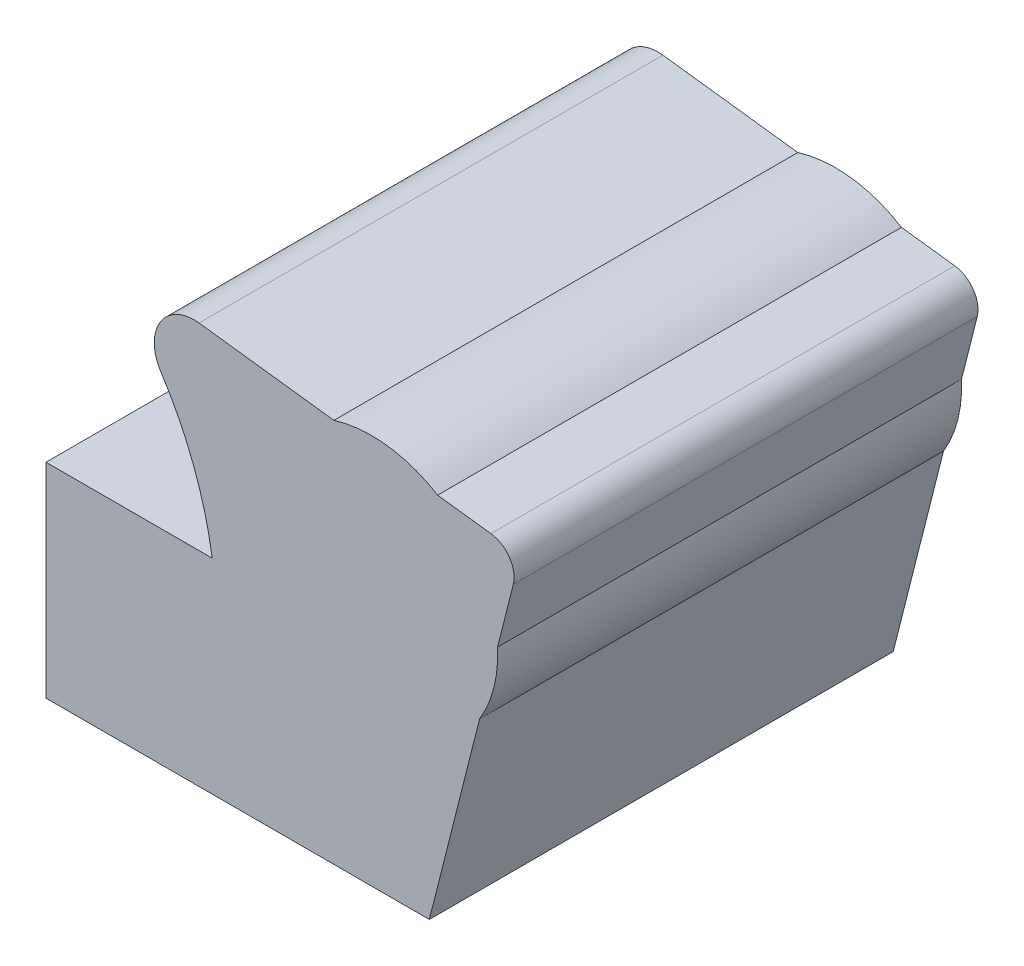
ISO-10303-21;
HEADER;
FILE_DESCRIPTION(('STEP AP214'),'2;1');
FILE_NAME('part.step','',(''),(''),'','','');
FILE_SCHEMA(('AUTOMOTIVE_DESIGN { 1 0 10303 214 1 1 1 1 }'));
ENDSEC;
DATA;
#1=APPLICATION_CONTEXT('core data for automotive mechanical design processes');
#2=APPLICATION_PROTOCOL_DEFINITION('international standard','automotive_design',2000,#1);
#3=PRODUCT_CONTEXT('',#1,'mechanical');
#4=PRODUCT('Part','Part','',(#3));
#5=PRODUCT_RELATED_PRODUCT_CATEGORY('part','',(#4));
#6=PRODUCT_DEFINITION_FORMATION('','',#4);
#7=PRODUCT_DEFINITION_CONTEXT('part definition',#1,'design');
#8=PRODUCT_DEFINITION('design','',#6,#7);
#9=PRODUCT_DEFINITION_SHAPE('','',#8);
#10=(LENGTH_UNIT() NAMED_UNIT(*) SI_UNIT(.MILLI.,.METRE.));
#11=(NAMED_UNIT(*) PLANE_ANGLE_UNIT() SI_UNIT($,.RADIAN.));
#12=(NAMED_UNIT(*) SI_UNIT($,.STERADIAN.) SOLID_ANGLE_UNIT());
#13=UNCERTAINTY_MEASURE_WITH_UNIT(LENGTH_MEASURE(1.E-05),#10,'distance_accuracy_value','');
#14=(GEOMETRIC_REPRESENTATION_CONTEXT(3) GLOBAL_UNCERTAINTY_ASSIGNED_CONTEXT((#13)) GLOBAL_UNIT_ASSIGNED_CONTEXT((#10,
#11,#12)) REPRESENTATION_CONTEXT('',''));
#15=CARTESIAN_POINT('',(0.,0.,0.));
#16=DIRECTION('',(0.,0.,1.));
#17=DIRECTION('',(1.,0.,0.));
#18=AXIS2_PLACEMENT_3D('',#15,#16,#17);
#19=CARTESIAN_POINT('',(18.9674720334947,82.2196640942758,50.));
#20=DIRECTION('',(0.,0.,-1.));
#21=DIRECTION('',(-1.,0.,0.));
#22=AXIS2_PLACEMENT_3D('',#19,#20,#21);
#23=CYLINDRICAL_SURFACE('',#22,74.3600000000827);
#24=CARTESIAN_POINT('',(18.9674720334947,82.2196640942758,-50.));
#25=DIRECTION('',(0.,0.,1.));
#26=DIRECTION('',(1.,0.,0.));
#27=AXIS2_PLACEMENT_3D('',#24,#25,#26);
#28=CIRCLE('',#27,74.3600000000827);
#29=CARTESIAN_POINT('',(92.4961728839557,93.3074840448214,-50.));
#30=VERTEX_POINT('',#29);
#31=CARTESIAN_POINT('',(81.3935081429262,122.622629525989,-50.));
#32=VERTEX_POINT('',#31);
#33=EDGE_CURVE('E133',#30,#32,#28,.T.);
#34=ORIENTED_EDGE('',*,*,#33,.F.);
#35=DIRECTION('',(0.,0.,-1.));
#36=VECTOR('',#35,1.);
#37=CARTESIAN_POINT('',(92.4961728839557,93.3074840448214,50.));
#38=LINE('',#37,#36);
#39=CARTESIAN_POINT('',(92.4961728839557,93.3074840448214,50.));
#40=VERTEX_POINT('',#39);
#41=EDGE_CURVE('E129',#40,#30,#38,.T.);
#42=ORIENTED_EDGE('',*,*,#41,.F.);
#43=CARTESIAN_POINT('',(18.9674720334947,82.2196640942758,50.));
#44=DIRECTION('',(0.,0.,1.));
#45=DIRECTION('',(1.,0.,0.));
#46=AXIS2_PLACEMENT_3D('',#43,#44,#45);
#47=CIRCLE('',#46,74.3600000000827);
#48=CARTESIAN_POINT('',(81.3935081429262,122.622629525989,50.));
#49=VERTEX_POINT('',#48);
#50=EDGE_CURVE('E131',#40,#49,#47,.T.);
#51=ORIENTED_EDGE('',*,*,#50,.T.);
#52=DIRECTION('',(0.,0.,-1.));
#53=VECTOR('',#52,1.);
#54=CARTESIAN_POINT('',(81.3935081429262,122.622629525989,50.));
#55=LINE('',#54,#53);
#56=EDGE_CURVE('E138',#49,#32,#55,.T.);
#57=ORIENTED_EDGE('',*,*,#56,.T.);
#58=EDGE_LOOP('',(#34,#42,#51,#57));
#59=FACE_BOUND('',#58,.T.);
#60=ADVANCED_FACE('F41',(#59),#23,.F.);
#61=CARTESIAN_POINT('',(88.5965123093914,127.284510152721,50.));
#62=DIRECTION('',(0.,0.,-1.));
#63=DIRECTION('',(-1.,0.,0.));
#64=AXIS2_PLACEMENT_3D('',#61,#62,#63);
#65=CYLINDRICAL_SURFACE('',#64,8.58000000000036);
#66=CARTESIAN_POINT('',(88.5965123093914,127.284510152721,-50.));
#67=DIRECTION('',(0.,0.,-1.));
#68=DIRECTION('',(-1.,0.,0.));
#69=AXIS2_PLACEMENT_3D('',#66,#67,#68);
#70=CIRCLE('',#69,8.58000000000036);
#71=CARTESIAN_POINT('',(89.6610000000004,135.798220622107,-50.));
#72=VERTEX_POINT('',#71);
#73=EDGE_CURVE('E175',#32,#72,#70,.T.);
#74=ORIENTED_EDGE('',*,*,#73,.F.);
#75=ORIENTED_EDGE('',*,*,#56,.F.);
#76=CARTESIAN_POINT('',(88.5965123093914,127.284510152721,50.));
#77=DIRECTION('',(0.,0.,-1.));
#78=DIRECTION('',(-1.,0.,0.));
#79=AXIS2_PLACEMENT_3D('',#76,#77,#78);
#80=CIRCLE('',#79,8.58000000000036);
#81=CARTESIAN_POINT('',(89.6610000000004,135.798220622107,50.));
#82=VERTEX_POINT('',#81);
#83=EDGE_CURVE('E148',#49,#82,#80,.T.);
#84=ORIENTED_EDGE('',*,*,#83,.T.);
#85=DIRECTION('',(0.,0.,-1.));
#86=VECTOR('',#85,1.);
#87=CARTESIAN_POINT('',(89.6610000000004,135.798220622107,50.));
#88=LINE('',#87,#86);
#89=EDGE_CURVE('E200',#82,#72,#88,.T.);
#90=ORIENTED_EDGE('',*,*,#89,.T.);
#91=EDGE_LOOP('',(#74,#75,#84,#90));
#92=FACE_BOUND('',#91,.T.);
#93=ADVANCED_FACE('F246',(#92),#65,.T.);
#94=CARTESIAN_POINT('',(152.575658460408,127.931864380515,50.));
#95=DIRECTION('',(-0.124066164406642,-0.992273947480948,0.));
#96=DIRECTION('',(0.992273947480949,-0.124066164406642,0.));
#97=AXIS2_PLACEMENT_3D('',#94,#95,#96);
#98=PLANE('',#97);
#99=DIRECTION('',(0.,0.,-1.));
#100=VECTOR('',#99,1.);
#101=CARTESIAN_POINT('',(118.740404112364,132.162359637739,50.));
#102=LINE('',#101,#100);
#103=CARTESIAN_POINT('',(118.740404112364,132.162359637739,-50.));
#104=VERTEX_POINT('',#103);
#105=CARTESIAN_POINT('',(118.740404112364,132.162359637739,50.));
#106=VERTEX_POINT('',#105);
#107=EDGE_CURVE('E212',#104,#106,#102,.F.);
#108=ORIENTED_EDGE('',*,*,#107,.F.);
#109=DIRECTION('',(-0.992273947480948,0.124066164406642,0.));
#110=VECTOR('',#109,1.);
#111=CARTESIAN_POINT('',(152.575658460408,127.931864380515,-50.));
#112=LINE('',#111,#110);
#113=EDGE_CURVE('E178',#104,#72,#112,.T.);
#114=ORIENTED_EDGE('',*,*,#113,.T.);
#115=ORIENTED_EDGE('',*,*,#89,.F.);
#116=DIRECTION('',(-0.992273947480948,0.124066164406642,0.));
#117=VECTOR('',#116,1.);
#118=CARTESIAN_POINT('',(152.575658460408,127.931864380515,50.));
#119=LINE('',#118,#117);
#120=EDGE_CURVE('E159',#106,#82,#119,.T.);
#121=ORIENTED_EDGE('',*,*,#120,.F.);
#122=EDGE_LOOP('',(#108,#114,#115,#121));
#123=FACE_BOUND('',#122,.T.);
#124=ADVANCED_FACE('F242',(#123),#98,.F.);
#125=CARTESIAN_POINT('',(126.841000000001,106.1775,50.));
#126=DIRECTION('',(0.,0.,-1.));
#127=DIRECTION('',(-1.,0.,0.));
#128=AXIS2_PLACEMENT_3D('',#125,#126,#127);
#129=CYLINDRICAL_SURFACE('',#128,27.2182399160523);
#130=CARTESIAN_POINT('',(126.841000000001,106.1775,-50.));
#131=DIRECTION('',(0.,0.,1.));
#132=DIRECTION('',(1.,0.,0.));
#133=AXIS2_PLACEMENT_3D('',#130,#131,#132);
#134=CIRCLE('',#133,27.2182399160523);
#135=CARTESIAN_POINT('',(141.09008904293,129.367930042896,-50.));
#136=VERTEX_POINT('',#135);
#137=EDGE_CURVE('E207',#136,#104,#134,.T.);
#138=ORIENTED_EDGE('',*,*,#137,.T.);
#139=ORIENTED_EDGE('',*,*,#107,.T.);
#140=CARTESIAN_POINT('',(126.841000000001,106.1775,50.));
#141=DIRECTION('',(0.,0.,1.));
#142=DIRECTION('',(1.,0.,0.));
#143=AXIS2_PLACEMENT_3D('',#140,#141,#142);
#144=CIRCLE('',#143,27.2182399160523);
#145=CARTESIAN_POINT('',(141.09008904293,129.367930042896,50.));
#146=VERTEX_POINT('',#145);
#147=EDGE_CURVE('E173',#146,#106,#144,.T.);
#148=ORIENTED_EDGE('',*,*,#147,.F.);
#149=DIRECTION('',(0.,0.,-1.));
#150=VECTOR('',#149,1.);
#151=CARTESIAN_POINT('',(141.09008904293,129.367930042896,50.));
#152=LINE('',#151,#150);
#153=EDGE_CURVE('E190',#146,#136,#152,.T.);
#154=ORIENTED_EDGE('',*,*,#153,.T.);
#155=EDGE_LOOP('',(#138,#139,#148,#154));
#156=FACE_BOUND('',#155,.T.);
#157=ADVANCED_FACE('F239',(#156),#129,.T.);
#158=ORIENTED_EDGE('',*,*,#153,.F.);
#159=CARTESIAN_POINT('',(152.575658460408,127.931864380515,50.));
#160=VERTEX_POINT('',#159);
#161=EDGE_CURVE('E160',#160,#146,#119,.T.);
#162=ORIENTED_EDGE('',*,*,#161,.F.);
#163=DIRECTION('',(0.,0.,-1.));
#164=VECTOR('',#163,1.);
#165=CARTESIAN_POINT('',(152.575658460408,127.931864380515,50.));
#166=LINE('',#165,#164);
#167=CARTESIAN_POINT('',(152.575658460408,127.931864380515,-50.));
#168=VERTEX_POINT('',#167);
#169=EDGE_CURVE('E197',#160,#168,#166,.T.);
#170=ORIENTED_EDGE('',*,*,#169,.T.);
#171=EDGE_CURVE('E179',#168,#136,#112,.T.);
#172=ORIENTED_EDGE('',*,*,#171,.T.);
#173=EDGE_LOOP('',(#158,#162,#170,#172));
#174=FACE_BOUND('',#173,.T.);
#175=ADVANCED_FACE('F234',(#174),#98,.F.);
#176=CARTESIAN_POINT('',(151.866000000002,122.256057400924,50.));
#177=DIRECTION('',(0.,0.,-1.));
#178=DIRECTION('',(-1.,0.,0.));
#179=AXIS2_PLACEMENT_3D('',#176,#177,#178);
#180=CYLINDRICAL_SURFACE('',#179,5.71999999999996);
#181=CARTESIAN_POINT('',(151.866000000002,122.256057400924,-50.));
#182=DIRECTION('',(0.,0.,1.));
#183=DIRECTION('',(1.,0.,0.));
#184=AXIS2_PLACEMENT_3D('',#181,#182,#183);
#185=CIRCLE('',#184,5.71999999999996);
#186=CARTESIAN_POINT('',(157.411382405651,120.85351186686,-50.));
#187=VERTEX_POINT('',#186);
#188=EDGE_CURVE('E182',#187,#168,#185,.T.);
#189=ORIENTED_EDGE('',*,*,#188,.T.);
#190=ORIENTED_EDGE('',*,*,#169,.F.);
#191=CARTESIAN_POINT('',(151.866000000002,122.256057400924,50.));
#192=DIRECTION('',(0.,0.,1.));
#193=DIRECTION('',(1.,0.,0.));
#194=AXIS2_PLACEMENT_3D('',#191,#192,#193);
#195=CIRCLE('',#194,5.71999999999996);
#196=CARTESIAN_POINT('',(157.411382405651,120.85351186686,50.));
#197=VERTEX_POINT('',#196);
#198=EDGE_CURVE('E163',#197,#160,#195,.T.);
#199=ORIENTED_EDGE('',*,*,#198,.F.);
#200=DIRECTION('',(0.,0.,-1.));
#201=VECTOR('',#200,1.);
#202=CARTESIAN_POINT('',(157.411382405651,120.85351186686,50.));
#203=LINE('',#202,#201);
#204=EDGE_CURVE('E194',#197,#187,#203,.T.);
#205=ORIENTED_EDGE('',*,*,#204,.T.);
#206=EDGE_LOOP('',(#189,#190,#199,#205));
#207=FACE_BOUND('',#206,.T.);
#208=ADVANCED_FACE('F228',(#207),#180,.T.);
#209=CARTESIAN_POINT('',(139.303205184739,49.2574282315053,50.));
#210=DIRECTION('',(-0.969472448539981,0.24520026819295,0.));
#211=DIRECTION('',(-0.24520026819295,-0.969472448539981,0.));
#212=AXIS2_PLACEMENT_3D('',#209,#210,#211);
#213=PLANE('',#212);
#214=DIRECTION('',(0.,0.,-1.));
#215=VECTOR('',#214,1.);
#216=CARTESIAN_POINT('',(154.028196984966,107.477078481087,50.));
#217=LINE('',#216,#215);
#218=CARTESIAN_POINT('',(154.028196984966,107.477078481087,-50.));
#219=VERTEX_POINT('',#218);
#220=CARTESIAN_POINT('',(154.028196984966,107.477078481087,50.));
#221=VERTEX_POINT('',#220);
#222=EDGE_CURVE('E49',#219,#221,#217,.F.);
#223=ORIENTED_EDGE('',*,*,#222,.F.);
#224=DIRECTION('',(0.24520026819295,0.96947244853998,0.));
#225=VECTOR('',#224,1.);
#226=CARTESIAN_POINT('',(139.303205184739,49.2574282315053,-50.));
#227=LINE('',#226,#225);
#228=EDGE_CURVE('E184',#219,#187,#227,.T.);
#229=ORIENTED_EDGE('',*,*,#228,.T.);
#230=ORIENTED_EDGE('',*,*,#204,.F.);
#231=DIRECTION('',(0.24520026819295,0.96947244853998,0.));
#232=VECTOR('',#231,1.);
#233=CARTESIAN_POINT('',(139.303205184739,49.2574282315053,50.));
#234=LINE('',#233,#232);
#235=EDGE_CURVE('E165',#221,#197,#234,.T.);
#236=ORIENTED_EDGE('',*,*,#235,.F.);
#237=EDGE_LOOP('',(#223,#229,#230,#236));
#238=FACE_BOUND('',#237,.T.);
#239=ADVANCED_FACE('F223',(#238),#213,.F.);
#240=CARTESIAN_POINT('',(150.141177621161,92.1085872150625,-50.));
#241=VERTEX_POINT('',#240);
#242=EDGE_CURVE('E208',#241,#219,#134,.T.);
#243=ORIENTED_EDGE('',*,*,#242,.T.);
#244=ORIENTED_EDGE('',*,*,#222,.T.);
#245=CARTESIAN_POINT('',(150.141177621161,92.1085872150625,50.));
#246=VERTEX_POINT('',#245);
#247=EDGE_CURVE('E204',#246,#221,#144,.T.);
#248=ORIENTED_EDGE('',*,*,#247,.F.);
#249=DIRECTION('',(0.,0.,-1.));
#250=VECTOR('',#249,1.);
#251=CARTESIAN_POINT('',(150.141177621161,92.1085872150625,50.));
#252=LINE('',#251,#250);
#253=EDGE_CURVE('E214',#246,#241,#252,.T.);
#254=ORIENTED_EDGE('',*,*,#253,.T.);
#255=EDGE_LOOP('',(#243,#244,#248,#254));
#256=FACE_BOUND('',#255,.T.);
#257=ADVANCED_FACE('F43',(#256),#129,.T.);
#258=CARTESIAN_POINT('',(56.6720409296533,93.3074840448214,50.));
#259=DIRECTION('',(0.,1.,0.));
#260=DIRECTION('',(0.,0.,1.));
#261=AXIS2_PLACEMENT_3D('',#258,#259,#260);
#262=PLANE('',#261);
#263=DIRECTION('',(1.,0.,0.));
#264=VECTOR('',#263,1.);
#265=CARTESIAN_POINT('',(56.6720409296533,93.3074840448214,-50.));
#266=LINE('',#265,#264);
#267=CARTESIAN_POINT('',(56.6720409296533,93.3074840448214,-50.));
#268=VERTEX_POINT('',#267);
#269=EDGE_CURVE('E171',#268,#30,#266,.T.);
#270=ORIENTED_EDGE('',*,*,#269,.F.);
#271=DIRECTION('',(0.,0.,-1.));
#272=VECTOR('',#271,1.);
#273=CARTESIAN_POINT('',(56.6720409296533,93.3074840448214,50.));
#274=LINE('',#273,#272);
#275=CARTESIAN_POINT('',(56.6720409296533,93.3074840448214,50.));
#276=VERTEX_POINT('',#275);
#277=EDGE_CURVE('E153',#276,#268,#274,.T.);
#278=ORIENTED_EDGE('',*,*,#277,.F.);
#279=DIRECTION('',(1.,0.,0.));
#280=VECTOR('',#279,1.);
#281=CARTESIAN_POINT('',(56.6720409296533,93.3074840448214,50.));
#282=LINE('',#281,#280);
#283=EDGE_CURVE('E146',#276,#40,#282,.T.);
#284=ORIENTED_EDGE('',*,*,#283,.T.);
#285=ORIENTED_EDGE('',*,*,#41,.T.);
#286=EDGE_LOOP('',(#270,#278,#284,#285));
#287=FACE_BOUND('',#286,.T.);
#288=ADVANCED_FACE('F151',(#287),#262,.T.);
#289=CARTESIAN_POINT('',(18.9674720334947,82.2196640942758,50.));
#290=DIRECTION('',(0.,0.,1.));
#291=DIRECTION('',(1.,0.,0.));
#292=AXIS2_PLACEMENT_3D('',#289,#290,#291);
#293=PLANE('',#292);
#294=DIRECTION('',(0.,1.,0.));
#295=VECTOR('',#294,1.);
#296=CARTESIAN_POINT('',(56.6720409296533,43.5041088750114,50.));
#297=LINE('',#296,#295);
#298=CARTESIAN_POINT('',(56.6720409296533,49.2574282315053,50.));
#299=VERTEX_POINT('',#298);
#300=EDGE_CURVE('E139',#299,#276,#297,.T.);
#301=ORIENTED_EDGE('',*,*,#300,.F.);
#302=DIRECTION('',(1.,0.,0.));
#303=VECTOR('',#302,1.);
#304=CARTESIAN_POINT('',(123.35351613374,49.2574282315053,50.));
#305=LINE('',#304,#303);
#306=CARTESIAN_POINT('',(139.303205184739,49.2574282315053,50.));
#307=VERTEX_POINT('',#306);
#308=EDGE_CURVE('E62',#299,#307,#305,.T.);
#309=ORIENTED_EDGE('',*,*,#308,.T.);
#310=EDGE_CURVE('E166',#307,#246,#234,.T.);
#311=ORIENTED_EDGE('',*,*,#310,.T.);
#312=ORIENTED_EDGE('',*,*,#247,.T.);
#313=ORIENTED_EDGE('',*,*,#235,.T.);
#314=ORIENTED_EDGE('',*,*,#198,.T.);
#315=ORIENTED_EDGE('',*,*,#161,.T.);
#316=ORIENTED_EDGE('',*,*,#147,.T.);
#317=ORIENTED_EDGE('',*,*,#120,.T.);
#318=ORIENTED_EDGE('',*,*,#83,.F.);
#319=ORIENTED_EDGE('',*,*,#50,.F.);
#320=ORIENTED_EDGE('',*,*,#283,.F.);
#321=EDGE_LOOP('',(#301,#309,#311,#312,#313,#314,#315,#316,#317,#318,#319,#320));
#322=FACE_BOUND('',#321,.T.);
#323=ADVANCED_FACE('F145',(#322),#293,.T.);
#324=ORIENTED_EDGE('',*,*,#253,.F.);
#325=ORIENTED_EDGE('',*,*,#310,.F.);
#326=DIRECTION('',(0.,0.,-1.));
#327=VECTOR('',#326,1.);
#328=CARTESIAN_POINT('',(139.303205184739,49.2574282315053,50.));
#329=LINE('',#328,#327);
#330=CARTESIAN_POINT('',(139.303205184739,49.2574282315053,-50.));
#331=VERTEX_POINT('',#330);
#332=EDGE_CURVE('E191',#307,#331,#329,.T.);
#333=ORIENTED_EDGE('',*,*,#332,.T.);
#334=EDGE_CURVE('E185',#331,#241,#227,.T.);
#335=ORIENTED_EDGE('',*,*,#334,.T.);
#336=EDGE_LOOP('',(#324,#325,#333,#335));
#337=FACE_BOUND('',#336,.T.);
#338=ADVANCED_FACE('F253',(#337),#213,.F.);
#339=CARTESIAN_POINT('',(18.9674720334947,82.2196640942758,-50.));
#340=DIRECTION('',(0.,0.,1.));
#341=DIRECTION('',(1.,0.,0.));
#342=AXIS2_PLACEMENT_3D('',#339,#340,#341);
#343=PLANE('',#342);
#344=DIRECTION('',(1.,0.,0.));
#345=VECTOR('',#344,1.);
#346=CARTESIAN_POINT('',(123.35351613374,49.2574282315053,-50.));
#347=LINE('',#346,#345);
#348=CARTESIAN_POINT('',(56.6720409296533,49.2574282315053,-50.));
#349=VERTEX_POINT('',#348);
#350=EDGE_CURVE('E56',#349,#331,#347,.T.);
#351=ORIENTED_EDGE('',*,*,#350,.F.);
#352=DIRECTION('',(0.,1.,0.));
#353=VECTOR('',#352,1.);
#354=CARTESIAN_POINT('',(56.6720409296533,43.5041088750114,-50.));
#355=LINE('',#354,#353);
#356=EDGE_CURVE('E154',#349,#268,#355,.T.);
#357=ORIENTED_EDGE('',*,*,#356,.T.);
#358=ORIENTED_EDGE('',*,*,#269,.T.);
#359=ORIENTED_EDGE('',*,*,#33,.T.);
#360=ORIENTED_EDGE('',*,*,#73,.T.);
#361=ORIENTED_EDGE('',*,*,#113,.F.);
#362=ORIENTED_EDGE('',*,*,#137,.F.);
#363=ORIENTED_EDGE('',*,*,#171,.F.);
#364=ORIENTED_EDGE('',*,*,#188,.F.);
#365=ORIENTED_EDGE('',*,*,#228,.F.);
#366=ORIENTED_EDGE('',*,*,#242,.F.);
#367=ORIENTED_EDGE('',*,*,#334,.F.);
#368=EDGE_LOOP('',(#351,#357,#358,#359,#360,#361,#362,#363,#364,#365,#366,#367));
#369=FACE_BOUND('',#368,.T.);
#370=ADVANCED_FACE('F247',(#369),#343,.F.);
#371=CARTESIAN_POINT('',(123.35351613374,49.2574282315053,50.));
#372=DIRECTION('',(0.,1.,0.));
#373=DIRECTION('',(-1.,0.,0.));
#374=AXIS2_PLACEMENT_3D('',#371,#372,#373);
#375=PLANE('',#374);
#376=ORIENTED_EDGE('',*,*,#350,.T.);
#377=ORIENTED_EDGE('',*,*,#332,.F.);
#378=ORIENTED_EDGE('',*,*,#308,.F.);
#379=DIRECTION('',(0.,0.,-1.));
#380=VECTOR('',#379,1.);
#381=CARTESIAN_POINT('',(56.6720409296533,49.2574282315053,50.));
#382=LINE('',#381,#380);
#383=EDGE_CURVE('E11',#299,#349,#382,.T.);
#384=ORIENTED_EDGE('',*,*,#383,.T.);
#385=EDGE_LOOP('',(#376,#377,#378,#384));
#386=FACE_BOUND('',#385,.T.);
#387=ADVANCED_FACE('F251',(#386),#375,.F.);
#388=CARTESIAN_POINT('',(56.6720409296533,43.5041088750114,50.));
#389=DIRECTION('',(-1.,0.,0.));
#390=DIRECTION('',(0.,-1.,0.));
#391=AXIS2_PLACEMENT_3D('',#388,#389,#390);
#392=PLANE('',#391);
#393=ORIENTED_EDGE('',*,*,#383,.F.);
#394=ORIENTED_EDGE('',*,*,#300,.T.);
#395=ORIENTED_EDGE('',*,*,#277,.T.);
#396=ORIENTED_EDGE('',*,*,#356,.F.);
#397=EDGE_LOOP('',(#393,#394,#395,#396));
#398=FACE_BOUND('',#397,.T.);
#399=ADVANCED_FACE('F250',(#398),#392,.T.);
#400=CLOSED_SHELL('',(#60,#93,#124,#157,#175,#208,#239,#257,#288,#323,#338,#370,#387,#399));
#401=MANIFOLD_SOLID_BREP('B2',#400);
#402=ADVANCED_BREP_SHAPE_REPRESENTATION('',(#18,#401),#14);
#403=SHAPE_DEFINITION_REPRESENTATION(#9,#402);
ENDSEC;
END-ISO-10303-21;
